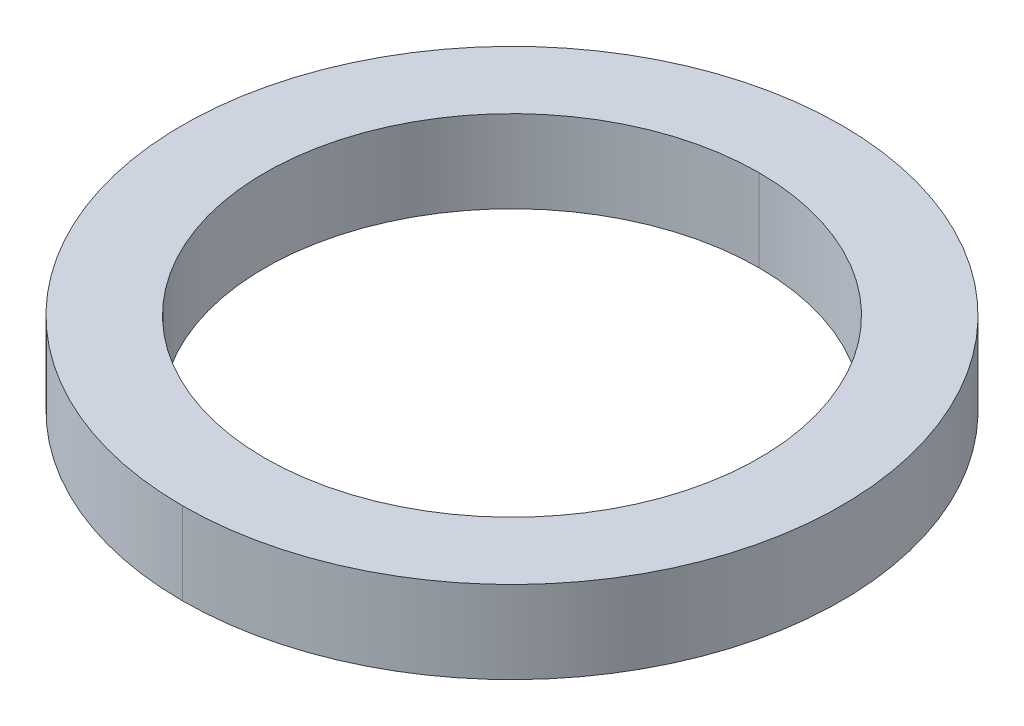
ISO-10303-21;
HEADER;
FILE_DESCRIPTION(('STEP AP214'),'2;1');
FILE_NAME('part.step','',(''),(''),'','','');
FILE_SCHEMA(('AUTOMOTIVE_DESIGN { 1 0 10303 214 1 1 1 1 }'));
ENDSEC;
DATA;
#1=APPLICATION_CONTEXT('core data for automotive mechanical design processes');
#2=APPLICATION_PROTOCOL_DEFINITION('international standard','automotive_design',2000,#1);
#3=PRODUCT_CONTEXT('',#1,'mechanical');
#4=PRODUCT('Part','Part','',(#3));
#5=PRODUCT_RELATED_PRODUCT_CATEGORY('part','',(#4));
#6=PRODUCT_DEFINITION_FORMATION('','',#4);
#7=PRODUCT_DEFINITION_CONTEXT('part definition',#1,'design');
#8=PRODUCT_DEFINITION('design','',#6,#7);
#9=PRODUCT_DEFINITION_SHAPE('','',#8);
#10=(LENGTH_UNIT() NAMED_UNIT(*) SI_UNIT(.MILLI.,.METRE.));
#11=(NAMED_UNIT(*) PLANE_ANGLE_UNIT() SI_UNIT($,.RADIAN.));
#12=(NAMED_UNIT(*) SI_UNIT($,.STERADIAN.) SOLID_ANGLE_UNIT());
#13=UNCERTAINTY_MEASURE_WITH_UNIT(LENGTH_MEASURE(1.E-05),#10,'distance_accuracy_value','');
#14=(GEOMETRIC_REPRESENTATION_CONTEXT(3) GLOBAL_UNCERTAINTY_ASSIGNED_CONTEXT((#13)) GLOBAL_UNIT_ASSIGNED_CONTEXT((#10,
#11,#12)) REPRESENTATION_CONTEXT('',''));
#15=CARTESIAN_POINT('',(0.,0.,0.));
#16=DIRECTION('',(0.,0.,1.));
#17=DIRECTION('',(1.,0.,0.));
#18=AXIS2_PLACEMENT_3D('',#15,#16,#17);
#19=CARTESIAN_POINT('',(0.,1.,0.));
#20=DIRECTION('',(0.,-1.,0.));
#21=DIRECTION('',(0.,0.,-1.));
#22=AXIS2_PLACEMENT_3D('',#19,#20,#21);
#23=CYLINDRICAL_SURFACE('',#22,3.);
#24=CARTESIAN_POINT('',(0.,1.,0.));
#25=DIRECTION('',(0.,1.,0.));
#26=DIRECTION('',(0.,0.,1.));
#27=AXIS2_PLACEMENT_3D('',#24,#25,#26);
#28=CIRCLE('',#27,3.);
#29=CARTESIAN_POINT('',(0.,1.,-3.));
#30=VERTEX_POINT('',#29);
#31=CARTESIAN_POINT('',(0.,1.,3.));
#32=VERTEX_POINT('',#31);
#33=EDGE_CURVE('E9',#30,#32,#28,.T.);
#34=ORIENTED_EDGE('',*,*,#33,.T.);
#35=DIRECTION('',(0.,-1.,0.));
#36=VECTOR('',#35,1.);
#37=CARTESIAN_POINT('',(0.,1.,3.));
#38=LINE('',#37,#36);
#39=CARTESIAN_POINT('',(0.,0.,3.));
#40=VERTEX_POINT('',#39);
#41=EDGE_CURVE('E26',#32,#40,#38,.T.);
#42=ORIENTED_EDGE('',*,*,#41,.T.);
#43=CARTESIAN_POINT('',(0.,0.,0.));
#44=DIRECTION('',(0.,1.,0.));
#45=DIRECTION('',(0.,0.,1.));
#46=AXIS2_PLACEMENT_3D('',#43,#44,#45);
#47=CIRCLE('',#46,3.);
#48=CARTESIAN_POINT('',(0.,0.,-3.));
#49=VERTEX_POINT('',#48);
#50=EDGE_CURVE('E75',#49,#40,#47,.T.);
#51=ORIENTED_EDGE('',*,*,#50,.F.);
#52=DIRECTION('',(0.,-1.,0.));
#53=VECTOR('',#52,1.);
#54=CARTESIAN_POINT('',(0.,1.,-3.));
#55=LINE('',#54,#53);
#56=EDGE_CURVE('E65',#30,#49,#55,.T.);
#57=ORIENTED_EDGE('',*,*,#56,.F.);
#58=EDGE_LOOP('',(#34,#42,#51,#57));
#59=FACE_BOUND('',#58,.T.);
#60=ADVANCED_FACE('F15',(#59),#23,.F.);
#61=CARTESIAN_POINT('',(0.,1.,0.));
#62=DIRECTION('',(0.,-1.,0.));
#63=DIRECTION('',(0.,0.,-1.));
#64=AXIS2_PLACEMENT_3D('',#61,#62,#63);
#65=CYLINDRICAL_SURFACE('',#64,4.);
#66=CARTESIAN_POINT('',(0.,1.,0.));
#67=DIRECTION('',(0.,1.,0.));
#68=DIRECTION('',(0.,0.,1.));
#69=AXIS2_PLACEMENT_3D('',#66,#67,#68);
#70=CIRCLE('',#69,4.);
#71=CARTESIAN_POINT('',(0.,1.,4.));
#72=VERTEX_POINT('',#71);
#73=CARTESIAN_POINT('',(0.,1.,-4.));
#74=VERTEX_POINT('',#73);
#75=EDGE_CURVE('E78',#72,#74,#70,.T.);
#76=ORIENTED_EDGE('',*,*,#75,.F.);
#77=DIRECTION('',(0.,-1.,0.));
#78=VECTOR('',#77,1.);
#79=CARTESIAN_POINT('',(0.,1.,4.));
#80=LINE('',#79,#78);
#81=CARTESIAN_POINT('',(0.,0.,4.));
#82=VERTEX_POINT('',#81);
#83=EDGE_CURVE('E109',#72,#82,#80,.T.);
#84=ORIENTED_EDGE('',*,*,#83,.T.);
#85=CARTESIAN_POINT('',(0.,0.,0.));
#86=DIRECTION('',(0.,1.,0.));
#87=DIRECTION('',(0.,0.,1.));
#88=AXIS2_PLACEMENT_3D('',#85,#86,#87);
#89=CIRCLE('',#88,4.);
#90=CARTESIAN_POINT('',(0.,0.,-4.));
#91=VERTEX_POINT('',#90);
#92=EDGE_CURVE('E101',#82,#91,#89,.T.);
#93=ORIENTED_EDGE('',*,*,#92,.T.);
#94=DIRECTION('',(0.,-1.,0.));
#95=VECTOR('',#94,1.);
#96=CARTESIAN_POINT('',(0.,1.,-4.));
#97=LINE('',#96,#95);
#98=EDGE_CURVE('E82',#74,#91,#97,.T.);
#99=ORIENTED_EDGE('',*,*,#98,.F.);
#100=EDGE_LOOP('',(#76,#84,#93,#99));
#101=FACE_BOUND('',#100,.T.);
#102=ADVANCED_FACE('F17',(#101),#65,.T.);
#103=CARTESIAN_POINT('',(0.,1.,0.));
#104=DIRECTION('',(0.,1.,0.));
#105=DIRECTION('',(1.,0.,0.));
#106=AXIS2_PLACEMENT_3D('',#103,#104,#105);
#107=PLANE('',#106);
#108=CARTESIAN_POINT('',(0.,1.,0.));
#109=DIRECTION('',(0.,1.,0.));
#110=DIRECTION('',(0.,0.,1.));
#111=AXIS2_PLACEMENT_3D('',#108,#109,#110);
#112=CIRCLE('',#111,4.);
#113=EDGE_CURVE('E106',#74,#72,#112,.T.);
#114=ORIENTED_EDGE('',*,*,#113,.T.);
#115=ORIENTED_EDGE('',*,*,#75,.T.);
#116=EDGE_LOOP('',(#114,#115));
#117=FACE_BOUND('',#116,.T.);
#118=ORIENTED_EDGE('',*,*,#33,.F.);
#119=CARTESIAN_POINT('',(0.,1.,0.));
#120=DIRECTION('',(0.,1.,0.));
#121=DIRECTION('',(0.,0.,1.));
#122=AXIS2_PLACEMENT_3D('',#119,#120,#121);
#123=CIRCLE('',#122,3.);
#124=EDGE_CURVE('E70',#32,#30,#123,.T.);
#125=ORIENTED_EDGE('',*,*,#124,.F.);
#126=EDGE_LOOP('',(#118,#125));
#127=FACE_BOUND('',#126,.T.);
#128=ADVANCED_FACE('F123',(#117,#127),#107,.T.);
#129=CARTESIAN_POINT('',(0.,0.,0.));
#130=DIRECTION('',(0.,1.,0.));
#131=DIRECTION('',(1.,0.,0.));
#132=AXIS2_PLACEMENT_3D('',#129,#130,#131);
#133=PLANE('',#132);
#134=CARTESIAN_POINT('',(0.,0.,0.));
#135=DIRECTION('',(0.,1.,0.));
#136=DIRECTION('',(0.,0.,1.));
#137=AXIS2_PLACEMENT_3D('',#134,#135,#136);
#138=CIRCLE('',#137,4.);
#139=EDGE_CURVE('E89',#91,#82,#138,.T.);
#140=ORIENTED_EDGE('',*,*,#139,.F.);
#141=ORIENTED_EDGE('',*,*,#92,.F.);
#142=EDGE_LOOP('',(#140,#141));
#143=FACE_BOUND('',#142,.T.);
#144=ORIENTED_EDGE('',*,*,#50,.T.);
#145=CARTESIAN_POINT('',(0.,0.,0.));
#146=DIRECTION('',(0.,1.,0.));
#147=DIRECTION('',(0.,0.,1.));
#148=AXIS2_PLACEMENT_3D('',#145,#146,#147);
#149=CIRCLE('',#148,3.);
#150=EDGE_CURVE('E19',#40,#49,#149,.T.);
#151=ORIENTED_EDGE('',*,*,#150,.T.);
#152=EDGE_LOOP('',(#144,#151));
#153=FACE_BOUND('',#152,.T.);
#154=ADVANCED_FACE('F80',(#143,#153),#133,.F.);
#155=CARTESIAN_POINT('',(0.,1.,0.));
#156=DIRECTION('',(0.,-1.,0.));
#157=DIRECTION('',(0.,0.,-1.));
#158=AXIS2_PLACEMENT_3D('',#155,#156,#157);
#159=CYLINDRICAL_SURFACE('',#158,4.);
#160=ORIENTED_EDGE('',*,*,#83,.F.);
#161=ORIENTED_EDGE('',*,*,#113,.F.);
#162=ORIENTED_EDGE('',*,*,#98,.T.);
#163=ORIENTED_EDGE('',*,*,#139,.T.);
#164=EDGE_LOOP('',(#160,#161,#162,#163));
#165=FACE_BOUND('',#164,.T.);
#166=ADVANCED_FACE('F121',(#165),#159,.T.);
#167=CARTESIAN_POINT('',(0.,1.,0.));
#168=DIRECTION('',(0.,-1.,0.));
#169=DIRECTION('',(0.,0.,-1.));
#170=AXIS2_PLACEMENT_3D('',#167,#168,#169);
#171=CYLINDRICAL_SURFACE('',#170,3.);
#172=ORIENTED_EDGE('',*,*,#41,.F.);
#173=ORIENTED_EDGE('',*,*,#124,.T.);
#174=ORIENTED_EDGE('',*,*,#56,.T.);
#175=ORIENTED_EDGE('',*,*,#150,.F.);
#176=EDGE_LOOP('',(#172,#173,#174,#175));
#177=FACE_BOUND('',#176,.T.);
#178=ADVANCED_FACE('F67',(#177),#171,.F.);
#179=CLOSED_SHELL('',(#60,#102,#128,#154,#166,#178));
#180=MANIFOLD_SOLID_BREP('B1',#179);
#181=ADVANCED_BREP_SHAPE_REPRESENTATION('',(#18,#180),#14);
#182=SHAPE_DEFINITION_REPRESENTATION(#9,#181);
ENDSEC;
END-ISO-10303-21;
